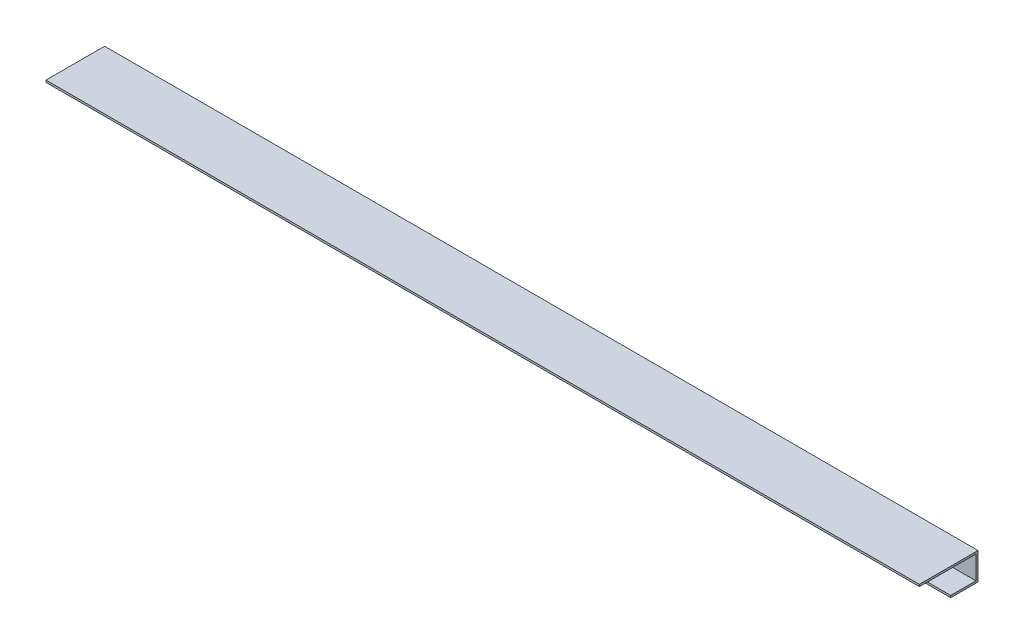
ISO-10303-21;
HEADER;
FILE_DESCRIPTION(('STEP AP214'),'2;1');
FILE_NAME('part.step','',(''),(''),'','','');
FILE_SCHEMA(('AUTOMOTIVE_DESIGN { 1 0 10303 214 1 1 1 1 }'));
ENDSEC;
DATA;
#1=APPLICATION_CONTEXT('core data for automotive mechanical design processes');
#2=APPLICATION_PROTOCOL_DEFINITION('international standard','automotive_design',2000,#1);
#3=PRODUCT_CONTEXT('',#1,'mechanical');
#4=PRODUCT('Part','Part','',(#3));
#5=PRODUCT_RELATED_PRODUCT_CATEGORY('part','',(#4));
#6=PRODUCT_DEFINITION_FORMATION('','',#4);
#7=PRODUCT_DEFINITION_CONTEXT('part definition',#1,'design');
#8=PRODUCT_DEFINITION('design','',#6,#7);
#9=PRODUCT_DEFINITION_SHAPE('','',#8);
#10=(LENGTH_UNIT() NAMED_UNIT(*) SI_UNIT(.MILLI.,.METRE.));
#11=(NAMED_UNIT(*) PLANE_ANGLE_UNIT() SI_UNIT($,.RADIAN.));
#12=(NAMED_UNIT(*) SI_UNIT($,.STERADIAN.) SOLID_ANGLE_UNIT());
#13=UNCERTAINTY_MEASURE_WITH_UNIT(LENGTH_MEASURE(1.E-05),#10,'distance_accuracy_value','');
#14=(GEOMETRIC_REPRESENTATION_CONTEXT(3) GLOBAL_UNCERTAINTY_ASSIGNED_CONTEXT((#13)) GLOBAL_UNIT_ASSIGNED_CONTEXT((#10,
#11,#12)) REPRESENTATION_CONTEXT('',''));
#15=CARTESIAN_POINT('',(0.,0.,0.));
#16=DIRECTION('',(0.,0.,1.));
#17=DIRECTION('',(1.,0.,0.));
#18=AXIS2_PLACEMENT_3D('',#15,#16,#17);
#19=CARTESIAN_POINT('',(864.,0.,0.));
#20=DIRECTION('',(0.,0.,-1.));
#21=DIRECTION('',(-1.,0.,0.));
#22=AXIS2_PLACEMENT_3D('',#19,#20,#21);
#23=PLANE('',#22);
#24=DIRECTION('',(0.,-1.,0.));
#25=VECTOR('',#24,1.);
#26=CARTESIAN_POINT('',(0.,0.,0.));
#27=LINE('',#26,#25);
#28=CARTESIAN_POINT('',(0.,0.,0.));
#29=VERTEX_POINT('',#28);
#30=CARTESIAN_POINT('',(0.,-2.,0.));
#31=VERTEX_POINT('',#30);
#32=EDGE_CURVE('E129',#29,#31,#27,.T.);
#33=ORIENTED_EDGE('',*,*,#32,.T.);
#34=DIRECTION('',(-1.,0.,0.));
#35=VECTOR('',#34,1.);
#36=CARTESIAN_POINT('',(864.,-2.,0.));
#37=LINE('',#36,#35);
#38=CARTESIAN_POINT('',(864.,-2.,0.));
#39=VERTEX_POINT('',#38);
#40=EDGE_CURVE('E11',#39,#31,#37,.T.);
#41=ORIENTED_EDGE('',*,*,#40,.F.);
#42=DIRECTION('',(0.,-1.,0.));
#43=VECTOR('',#42,1.);
#44=CARTESIAN_POINT('',(864.,0.,0.));
#45=LINE('',#44,#43);
#46=CARTESIAN_POINT('',(864.,0.,0.));
#47=VERTEX_POINT('',#46);
#48=EDGE_CURVE('E143',#47,#39,#45,.T.);
#49=ORIENTED_EDGE('',*,*,#48,.F.);
#50=DIRECTION('',(-1.,0.,0.));
#51=VECTOR('',#50,1.);
#52=CARTESIAN_POINT('',(864.,0.,0.));
#53=LINE('',#52,#51);
#54=EDGE_CURVE('E125',#47,#29,#53,.T.);
#55=ORIENTED_EDGE('',*,*,#54,.T.);
#56=EDGE_LOOP('',(#33,#41,#49,#55));
#57=FACE_BOUND('',#56,.T.);
#58=ADVANCED_FACE('F33',(#57),#23,.F.);
#59=CARTESIAN_POINT('',(864.,-2.,0.));
#60=DIRECTION('',(0.,1.,0.));
#61=DIRECTION('',(0.,0.,1.));
#62=AXIS2_PLACEMENT_3D('',#59,#60,#61);
#63=PLANE('',#62);
#64=DIRECTION('',(0.,0.,-1.));
#65=VECTOR('',#64,1.);
#66=CARTESIAN_POINT('',(0.,-2.,0.));
#67=LINE('',#66,#65);
#68=CARTESIAN_POINT('',(0.,-2.,-56.));
#69=VERTEX_POINT('',#68);
#70=EDGE_CURVE('E132',#31,#69,#67,.T.);
#71=ORIENTED_EDGE('',*,*,#70,.T.);
#72=DIRECTION('',(-1.,0.,0.));
#73=VECTOR('',#72,1.);
#74=CARTESIAN_POINT('',(864.,-2.,-56.));
#75=LINE('',#74,#73);
#76=CARTESIAN_POINT('',(864.,-2.,-56.));
#77=VERTEX_POINT('',#76);
#78=EDGE_CURVE('E41',#77,#69,#75,.T.);
#79=ORIENTED_EDGE('',*,*,#78,.F.);
#80=DIRECTION('',(0.,0.,-1.));
#81=VECTOR('',#80,1.);
#82=CARTESIAN_POINT('',(864.,-2.,0.));
#83=LINE('',#82,#81);
#84=EDGE_CURVE('E92',#39,#77,#83,.T.);
#85=ORIENTED_EDGE('',*,*,#84,.F.);
#86=ORIENTED_EDGE('',*,*,#40,.T.);
#87=EDGE_LOOP('',(#71,#79,#85,#86));
#88=FACE_BOUND('',#87,.T.);
#89=ADVANCED_FACE('F178',(#88),#63,.F.);
#90=CARTESIAN_POINT('',(864.,-2.,-56.));
#91=DIRECTION('',(0.,0.,-1.));
#92=DIRECTION('',(-1.,0.,0.));
#93=AXIS2_PLACEMENT_3D('',#90,#91,#92);
#94=PLANE('',#93);
#95=DIRECTION('',(0.,-1.,0.));
#96=VECTOR('',#95,1.);
#97=CARTESIAN_POINT('',(0.,-2.,-56.));
#98=LINE('',#97,#96);
#99=CARTESIAN_POINT('',(0.,-25.,-56.));
#100=VERTEX_POINT('',#99);
#101=EDGE_CURVE('E134',#69,#100,#98,.T.);
#102=ORIENTED_EDGE('',*,*,#101,.T.);
#103=DIRECTION('',(-1.,0.,0.));
#104=VECTOR('',#103,1.);
#105=CARTESIAN_POINT('',(864.,-25.,-56.));
#106=LINE('',#105,#104);
#107=CARTESIAN_POINT('',(864.,-25.,-56.));
#108=VERTEX_POINT('',#107);
#109=EDGE_CURVE('E150',#108,#100,#106,.T.);
#110=ORIENTED_EDGE('',*,*,#109,.F.);
#111=DIRECTION('',(0.,-1.,0.));
#112=VECTOR('',#111,1.);
#113=CARTESIAN_POINT('',(864.,-2.,-56.));
#114=LINE('',#113,#112);
#115=EDGE_CURVE('E158',#77,#108,#114,.T.);
#116=ORIENTED_EDGE('',*,*,#115,.F.);
#117=ORIENTED_EDGE('',*,*,#78,.T.);
#118=EDGE_LOOP('',(#102,#110,#116,#117));
#119=FACE_BOUND('',#118,.T.);
#120=ADVANCED_FACE('F156',(#119),#94,.F.);
#121=CARTESIAN_POINT('',(864.,-25.,-56.));
#122=DIRECTION('',(0.,-1.,0.));
#123=DIRECTION('',(0.,0.,-1.));
#124=AXIS2_PLACEMENT_3D('',#121,#122,#123);
#125=PLANE('',#124);
#126=DIRECTION('',(0.,0.,1.));
#127=VECTOR('',#126,1.);
#128=CARTESIAN_POINT('',(0.,-25.,-56.));
#129=LINE('',#128,#127);
#130=CARTESIAN_POINT('',(0.,-25.,-31.));
#131=VERTEX_POINT('',#130);
#132=EDGE_CURVE('E136',#100,#131,#129,.T.);
#133=ORIENTED_EDGE('',*,*,#132,.T.);
#134=DIRECTION('',(-1.,0.,0.));
#135=VECTOR('',#134,1.);
#136=CARTESIAN_POINT('',(864.,-25.,-31.));
#137=LINE('',#136,#135);
#138=CARTESIAN_POINT('',(864.,-25.,-31.));
#139=VERTEX_POINT('',#138);
#140=EDGE_CURVE('E147',#139,#131,#137,.T.);
#141=ORIENTED_EDGE('',*,*,#140,.F.);
#142=DIRECTION('',(0.,0.,1.));
#143=VECTOR('',#142,1.);
#144=CARTESIAN_POINT('',(864.,-25.,-56.));
#145=LINE('',#144,#143);
#146=EDGE_CURVE('E170',#108,#139,#145,.T.);
#147=ORIENTED_EDGE('',*,*,#146,.F.);
#148=ORIENTED_EDGE('',*,*,#109,.T.);
#149=EDGE_LOOP('',(#133,#141,#147,#148));
#150=FACE_BOUND('',#149,.T.);
#151=ADVANCED_FACE('F166',(#150),#125,.F.);
#152=CARTESIAN_POINT('',(864.,-25.,-31.));
#153=DIRECTION('',(0.,0.,-1.));
#154=DIRECTION('',(-1.,0.,0.));
#155=AXIS2_PLACEMENT_3D('',#152,#153,#154);
#156=PLANE('',#155);
#157=DIRECTION('',(0.,-1.,0.));
#158=VECTOR('',#157,1.);
#159=CARTESIAN_POINT('',(0.,-25.,-31.));
#160=LINE('',#159,#158);
#161=CARTESIAN_POINT('',(0.,-27.,-31.));
#162=VERTEX_POINT('',#161);
#163=EDGE_CURVE('E138',#131,#162,#160,.T.);
#164=ORIENTED_EDGE('',*,*,#163,.T.);
#165=DIRECTION('',(-1.,0.,0.));
#166=VECTOR('',#165,1.);
#167=CARTESIAN_POINT('',(864.,-27.,-31.));
#168=LINE('',#167,#166);
#169=CARTESIAN_POINT('',(864.,-27.,-31.));
#170=VERTEX_POINT('',#169);
#171=EDGE_CURVE('E120',#170,#162,#168,.T.);
#172=ORIENTED_EDGE('',*,*,#171,.F.);
#173=DIRECTION('',(0.,-1.,0.));
#174=VECTOR('',#173,1.);
#175=CARTESIAN_POINT('',(864.,-25.,-31.));
#176=LINE('',#175,#174);
#177=EDGE_CURVE('E111',#139,#170,#176,.T.);
#178=ORIENTED_EDGE('',*,*,#177,.F.);
#179=ORIENTED_EDGE('',*,*,#140,.T.);
#180=EDGE_LOOP('',(#164,#172,#178,#179));
#181=FACE_BOUND('',#180,.T.);
#182=ADVANCED_FACE('F169',(#181),#156,.F.);
#183=CARTESIAN_POINT('',(864.,-27.,-58.));
#184=DIRECTION('',(0.,1.,0.));
#185=DIRECTION('',(0.,0.,1.));
#186=AXIS2_PLACEMENT_3D('',#183,#184,#185);
#187=PLANE('',#186);
#188=DIRECTION('',(0.,0.,-1.));
#189=VECTOR('',#188,1.);
#190=CARTESIAN_POINT('',(0.,-27.,-58.));
#191=LINE('',#190,#189);
#192=CARTESIAN_POINT('',(0.,-27.,-58.));
#193=VERTEX_POINT('',#192);
#194=EDGE_CURVE('E119',#162,#193,#191,.T.);
#195=ORIENTED_EDGE('',*,*,#194,.T.);
#196=DIRECTION('',(-1.,0.,0.));
#197=VECTOR('',#196,1.);
#198=CARTESIAN_POINT('',(864.,-27.,-58.));
#199=LINE('',#198,#197);
#200=CARTESIAN_POINT('',(864.,-27.,-58.));
#201=VERTEX_POINT('',#200);
#202=EDGE_CURVE('E116',#201,#193,#199,.T.);
#203=ORIENTED_EDGE('',*,*,#202,.F.);
#204=DIRECTION('',(0.,0.,-1.));
#205=VECTOR('',#204,1.);
#206=CARTESIAN_POINT('',(864.,-27.,-58.));
#207=LINE('',#206,#205);
#208=EDGE_CURVE('E105',#170,#201,#207,.T.);
#209=ORIENTED_EDGE('',*,*,#208,.F.);
#210=ORIENTED_EDGE('',*,*,#171,.T.);
#211=EDGE_LOOP('',(#195,#203,#209,#210));
#212=FACE_BOUND('',#211,.T.);
#213=ADVANCED_FACE('F117',(#212),#187,.F.);
#214=CARTESIAN_POINT('',(864.,0.,-58.));
#215=DIRECTION('',(0.,0.,1.));
#216=DIRECTION('',(1.,0.,0.));
#217=AXIS2_PLACEMENT_3D('',#214,#215,#216);
#218=PLANE('',#217);
#219=DIRECTION('',(0.,1.,0.));
#220=VECTOR('',#219,1.);
#221=CARTESIAN_POINT('',(0.,0.,-58.));
#222=LINE('',#221,#220);
#223=CARTESIAN_POINT('',(0.,0.,-58.));
#224=VERTEX_POINT('',#223);
#225=EDGE_CURVE('E78',#193,#224,#222,.T.);
#226=ORIENTED_EDGE('',*,*,#225,.T.);
#227=DIRECTION('',(-1.,0.,0.));
#228=VECTOR('',#227,1.);
#229=CARTESIAN_POINT('',(864.,0.,-58.));
#230=LINE('',#229,#228);
#231=CARTESIAN_POINT('',(864.,0.,-58.));
#232=VERTEX_POINT('',#231);
#233=EDGE_CURVE('E121',#232,#224,#230,.T.);
#234=ORIENTED_EDGE('',*,*,#233,.F.);
#235=DIRECTION('',(0.,1.,0.));
#236=VECTOR('',#235,1.);
#237=CARTESIAN_POINT('',(864.,0.,-58.));
#238=LINE('',#237,#236);
#239=EDGE_CURVE('E109',#201,#232,#238,.T.);
#240=ORIENTED_EDGE('',*,*,#239,.F.);
#241=ORIENTED_EDGE('',*,*,#202,.T.);
#242=EDGE_LOOP('',(#226,#234,#240,#241));
#243=FACE_BOUND('',#242,.T.);
#244=ADVANCED_FACE('F123',(#243),#218,.F.);
#245=CARTESIAN_POINT('',(864.,0.,0.));
#246=DIRECTION('',(0.,-1.,0.));
#247=DIRECTION('',(0.,0.,-1.));
#248=AXIS2_PLACEMENT_3D('',#245,#246,#247);
#249=PLANE('',#248);
#250=DIRECTION('',(0.,0.,1.));
#251=VECTOR('',#250,1.);
#252=CARTESIAN_POINT('',(0.,0.,0.));
#253=LINE('',#252,#251);
#254=EDGE_CURVE('E84',#224,#29,#253,.T.);
#255=ORIENTED_EDGE('',*,*,#254,.T.);
#256=ORIENTED_EDGE('',*,*,#54,.F.);
#257=DIRECTION('',(0.,0.,1.));
#258=VECTOR('',#257,1.);
#259=CARTESIAN_POINT('',(864.,0.,0.));
#260=LINE('',#259,#258);
#261=EDGE_CURVE('E49',#232,#47,#260,.T.);
#262=ORIENTED_EDGE('',*,*,#261,.F.);
#263=ORIENTED_EDGE('',*,*,#233,.T.);
#264=EDGE_LOOP('',(#255,#256,#262,#263));
#265=FACE_BOUND('',#264,.T.);
#266=ADVANCED_FACE('F194',(#265),#249,.F.);
#267=CARTESIAN_POINT('',(864.,0.,0.));
#268=DIRECTION('',(1.,0.,0.));
#269=DIRECTION('',(0.,0.,-1.));
#270=AXIS2_PLACEMENT_3D('',#267,#268,#269);
#271=PLANE('',#270);
#272=ORIENTED_EDGE('',*,*,#48,.T.);
#273=ORIENTED_EDGE('',*,*,#84,.T.);
#274=ORIENTED_EDGE('',*,*,#115,.T.);
#275=ORIENTED_EDGE('',*,*,#146,.T.);
#276=ORIENTED_EDGE('',*,*,#177,.T.);
#277=ORIENTED_EDGE('',*,*,#208,.T.);
#278=ORIENTED_EDGE('',*,*,#239,.T.);
#279=ORIENTED_EDGE('',*,*,#261,.T.);
#280=EDGE_LOOP('',(#272,#273,#274,#275,#276,#277,#278,#279));
#281=FACE_BOUND('',#280,.T.);
#282=ADVANCED_FACE('F107',(#281),#271,.T.);
#283=CARTESIAN_POINT('',(0.,0.,0.));
#284=DIRECTION('',(1.,0.,0.));
#285=DIRECTION('',(0.,0.,-1.));
#286=AXIS2_PLACEMENT_3D('',#283,#284,#285);
#287=PLANE('',#286);
#288=ORIENTED_EDGE('',*,*,#32,.F.);
#289=ORIENTED_EDGE('',*,*,#254,.F.);
#290=ORIENTED_EDGE('',*,*,#225,.F.);
#291=ORIENTED_EDGE('',*,*,#194,.F.);
#292=ORIENTED_EDGE('',*,*,#163,.F.);
#293=ORIENTED_EDGE('',*,*,#132,.F.);
#294=ORIENTED_EDGE('',*,*,#101,.F.);
#295=ORIENTED_EDGE('',*,*,#70,.F.);
#296=EDGE_LOOP('',(#288,#289,#290,#291,#292,#293,#294,#295));
#297=FACE_BOUND('',#296,.T.);
#298=ADVANCED_FACE('F162',(#297),#287,.F.);
#299=CLOSED_SHELL('',(#58,#89,#120,#151,#182,#213,#244,#266,#282,#298));
#300=MANIFOLD_SOLID_BREP('B2',#299);
#301=ADVANCED_BREP_SHAPE_REPRESENTATION('',(#18,#300),#14);
#302=SHAPE_DEFINITION_REPRESENTATION(#9,#301);
ENDSEC;
END-ISO-10303-21;
